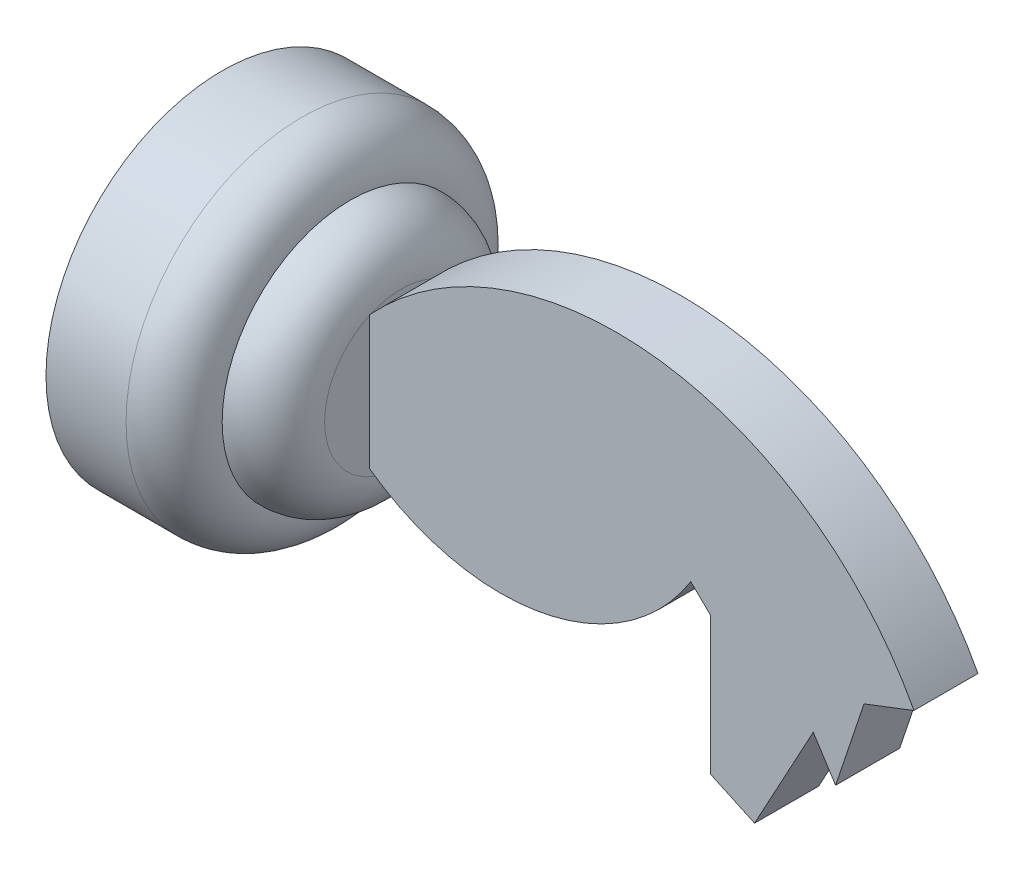
ISO-10303-21;
HEADER;
FILE_DESCRIPTION(('STEP AP214'),'2;1');
FILE_NAME('part.step','',(''),(''),'','','');
FILE_SCHEMA(('AUTOMOTIVE_DESIGN { 1 0 10303 214 1 1 1 1 }'));
ENDSEC;
DATA;
#1=APPLICATION_CONTEXT('core data for automotive mechanical design processes');
#2=APPLICATION_PROTOCOL_DEFINITION('international standard','automotive_design',2000,#1);
#3=PRODUCT_CONTEXT('',#1,'mechanical');
#4=PRODUCT('Part','Part','',(#3));
#5=PRODUCT_RELATED_PRODUCT_CATEGORY('part','',(#4));
#6=PRODUCT_DEFINITION_FORMATION('','',#4);
#7=PRODUCT_DEFINITION_CONTEXT('part definition',#1,'design');
#8=PRODUCT_DEFINITION('design','',#6,#7);
#9=PRODUCT_DEFINITION_SHAPE('','',#8);
#10=(LENGTH_UNIT() NAMED_UNIT(*) SI_UNIT(.MILLI.,.METRE.));
#11=(NAMED_UNIT(*) PLANE_ANGLE_UNIT() SI_UNIT($,.RADIAN.));
#12=(NAMED_UNIT(*) SI_UNIT($,.STERADIAN.) SOLID_ANGLE_UNIT());
#13=UNCERTAINTY_MEASURE_WITH_UNIT(LENGTH_MEASURE(1.E-05),#10,'distance_accuracy_value','');
#14=(GEOMETRIC_REPRESENTATION_CONTEXT(3) GLOBAL_UNCERTAINTY_ASSIGNED_CONTEXT((#13)) GLOBAL_UNIT_ASSIGNED_CONTEXT((#10,
#11,#12)) REPRESENTATION_CONTEXT('',''));
#15=CARTESIAN_POINT('',(0.,0.,0.));
#16=DIRECTION('',(0.,0.,1.));
#17=DIRECTION('',(1.,0.,0.));
#18=AXIS2_PLACEMENT_3D('',#15,#16,#17);
#19=CARTESIAN_POINT('',(11.2,0.,0.));
#20=DIRECTION('',(1.,0.,0.));
#21=DIRECTION('',(0.,0.,-1.));
#22=AXIS2_PLACEMENT_3D('',#19,#20,#21);
#23=PLANE('',#22);
#24=DIRECTION('',(0.,0.,-1.));
#25=VECTOR('',#24,1.);
#26=CARTESIAN_POINT('',(11.2,4.4,2.));
#27=LINE('',#26,#25);
#28=CARTESIAN_POINT('',(11.2,4.4,1.91833260932509));
#29=VERTEX_POINT('',#28);
#30=CARTESIAN_POINT('',(11.2,4.4,-1.91833260932509));
#31=VERTEX_POINT('',#30);
#32=EDGE_CURVE('E155',#29,#31,#27,.T.);
#33=ORIENTED_EDGE('',*,*,#32,.T.);
#34=CARTESIAN_POINT('',(11.2,0.,0.));
#35=DIRECTION('',(-1.,0.,0.));
#36=DIRECTION('',(0.,0.,1.));
#37=AXIS2_PLACEMENT_3D('',#34,#35,#36);
#38=CIRCLE('',#37,4.8);
#39=EDGE_CURVE('E55',#29,#31,#38,.T.);
#40=ORIENTED_EDGE('',*,*,#39,.F.);
#41=EDGE_LOOP('',(#33,#40));
#42=FACE_BOUND('',#41,.T.);
#43=ADVANCED_FACE('F47',(#42),#23,.T.);
#44=DIRECTION('',(0.,1.,0.));
#45=VECTOR('',#44,1.);
#46=CARTESIAN_POINT('',(11.2,0.,2.));
#47=LINE('',#46,#45);
#48=CARTESIAN_POINT('',(11.2,-3.91497825520678,2.));
#49=VERTEX_POINT('',#48);
#50=CARTESIAN_POINT('',(11.2,4.36348484585429,2.));
#51=VERTEX_POINT('',#50);
#52=EDGE_CURVE('E147',#49,#51,#47,.T.);
#53=ORIENTED_EDGE('',*,*,#52,.T.);
#54=CARTESIAN_POINT('',(11.2,4.36348484585429,-2.));
#55=VERTEX_POINT('',#54);
#56=EDGE_CURVE('E56',#55,#51,#38,.T.);
#57=ORIENTED_EDGE('',*,*,#56,.F.);
#58=DIRECTION('',(0.,1.,0.));
#59=VECTOR('',#58,1.);
#60=CARTESIAN_POINT('',(11.2,0.,-2.));
#61=LINE('',#60,#59);
#62=CARTESIAN_POINT('',(11.2,-3.91497825520678,-2.));
#63=VERTEX_POINT('',#62);
#64=EDGE_CURVE('E63',#63,#55,#61,.T.);
#65=ORIENTED_EDGE('',*,*,#64,.F.);
#66=DIRECTION('',(0.,0.,-1.));
#67=VECTOR('',#66,1.);
#68=CARTESIAN_POINT('',(11.2,-3.91497825520678,2.));
#69=LINE('',#68,#67);
#70=EDGE_CURVE('E225',#49,#63,#69,.T.);
#71=ORIENTED_EDGE('',*,*,#70,.F.);
#72=EDGE_LOOP('',(#53,#57,#65,#71));
#73=FACE_BOUND('',#72,.T.);
#74=ADVANCED_FACE('F49',(#73),#23,.T.);
#75=CARTESIAN_POINT('',(8.,0.,0.));
#76=DIRECTION('',(-1.,0.,0.));
#77=DIRECTION('',(0.,0.,1.));
#78=AXIS2_PLACEMENT_3D('',#75,#76,#77);
#79=TOROIDAL_SURFACE('',#78,4.8,3.2);
#80=CARTESIAN_POINT('',(8.,0.,0.));
#81=DIRECTION('',(-1.,0.,0.));
#82=DIRECTION('',(0.,0.,1.));
#83=AXIS2_PLACEMENT_3D('',#80,#81,#82);
#84=CIRCLE('',#83,8.);
#85=CARTESIAN_POINT('',(8.,0.,8.));
#86=VERTEX_POINT('',#85);
#87=EDGE_CURVE('E231',#86,#86,#84,.T.);
#88=ORIENTED_EDGE('',*,*,#87,.F.);
#89=EDGE_LOOP('',(#88));
#90=FACE_BOUND('',#89,.T.);
#91=EDGE_CURVE('E11',#51,#29,#38,.T.);
#92=ORIENTED_EDGE('',*,*,#91,.T.);
#93=ORIENTED_EDGE('',*,*,#39,.T.);
#94=EDGE_CURVE('E70',#31,#55,#38,.T.);
#95=ORIENTED_EDGE('',*,*,#94,.T.);
#96=ORIENTED_EDGE('',*,*,#56,.T.);
#97=EDGE_LOOP('',(#92,#93,#95,#96));
#98=FACE_BOUND('',#97,.T.);
#99=ADVANCED_FACE('F239',(#90,#98),#79,.T.);
#100=CARTESIAN_POINT('',(5.,0.,0.));
#101=DIRECTION('',(-1.,0.,0.));
#102=DIRECTION('',(0.,0.,1.));
#103=AXIS2_PLACEMENT_3D('',#100,#101,#102);
#104=TOROIDAL_SURFACE('',#103,8.,3.);
#105=ORIENTED_EDGE('',*,*,#87,.T.);
#106=EDGE_LOOP('',(#105));
#107=FACE_BOUND('',#106,.T.);
#108=CARTESIAN_POINT('',(5.,0.,0.));
#109=DIRECTION('',(-1.,0.,0.));
#110=DIRECTION('',(0.,0.,1.));
#111=AXIS2_PLACEMENT_3D('',#108,#109,#110);
#112=CIRCLE('',#111,11.);
#113=CARTESIAN_POINT('',(5.,0.,11.));
#114=VERTEX_POINT('',#113);
#115=EDGE_CURVE('E229',#114,#114,#112,.T.);
#116=ORIENTED_EDGE('',*,*,#115,.F.);
#117=EDGE_LOOP('',(#116));
#118=FACE_BOUND('',#117,.T.);
#119=ADVANCED_FACE('F287',(#107,#118),#104,.T.);
#120=CARTESIAN_POINT('',(0.,0.,0.));
#121=DIRECTION('',(-1.,0.,0.));
#122=DIRECTION('',(0.,0.,1.));
#123=AXIS2_PLACEMENT_3D('',#120,#121,#122);
#124=CYLINDRICAL_SURFACE('',#123,11.);
#125=ORIENTED_EDGE('',*,*,#115,.T.);
#126=EDGE_LOOP('',(#125));
#127=FACE_BOUND('',#126,.T.);
#128=CARTESIAN_POINT('',(0.,0.,0.));
#129=DIRECTION('',(-1.,0.,0.));
#130=DIRECTION('',(0.,0.,1.));
#131=AXIS2_PLACEMENT_3D('',#128,#129,#130);
#132=CIRCLE('',#131,11.);
#133=CARTESIAN_POINT('',(0.,0.,11.));
#134=VERTEX_POINT('',#133);
#135=EDGE_CURVE('E156',#134,#134,#132,.T.);
#136=ORIENTED_EDGE('',*,*,#135,.F.);
#137=EDGE_LOOP('',(#136));
#138=FACE_BOUND('',#137,.T.);
#139=ADVANCED_FACE('F300',(#127,#138),#124,.T.);
#140=CARTESIAN_POINT('',(0.,0.,0.));
#141=DIRECTION('',(-1.,0.,0.));
#142=DIRECTION('',(0.,0.,1.));
#143=AXIS2_PLACEMENT_3D('',#140,#141,#142);
#144=PLANE('',#143);
#145=ORIENTED_EDGE('',*,*,#135,.T.);
#146=EDGE_LOOP('',(#145));
#147=FACE_BOUND('',#146,.T.);
#148=ADVANCED_FACE('F296',(#147),#144,.T.);
#149=CARTESIAN_POINT('',(11.2,0.,2.));
#150=DIRECTION('',(-1.,0.,0.));
#151=DIRECTION('',(0.,0.,1.));
#152=AXIS2_PLACEMENT_3D('',#149,#150,#151);
#153=PLANE('',#152);
#154=ORIENTED_EDGE('',*,*,#91,.F.);
#155=CARTESIAN_POINT('',(11.2,4.4,2.));
#156=VERTEX_POINT('',#155);
#157=EDGE_CURVE('E139',#51,#156,#47,.T.);
#158=ORIENTED_EDGE('',*,*,#157,.T.);
#159=EDGE_CURVE('E142',#156,#29,#27,.T.);
#160=ORIENTED_EDGE('',*,*,#159,.T.);
#161=EDGE_LOOP('',(#154,#158,#160));
#162=FACE_BOUND('',#161,.T.);
#163=ADVANCED_FACE('F141',(#162),#153,.T.);
#164=CARTESIAN_POINT('',(26.6430950023222,-9.83062952751044,2.));
#165=DIRECTION('',(0.,0.,-1.));
#166=DIRECTION('',(-1.,0.,0.));
#167=AXIS2_PLACEMENT_3D('',#164,#165,#166);
#168=CYLINDRICAL_SURFACE('',#167,21.);
#169=CARTESIAN_POINT('',(26.6430950023222,-9.83062952751044,-2.));
#170=DIRECTION('',(0.,0.,1.));
#171=DIRECTION('',(1.,0.,0.));
#172=AXIS2_PLACEMENT_3D('',#169,#170,#171);
#173=CIRCLE('',#172,21.);
#174=CARTESIAN_POINT('',(11.2,4.4,-2.));
#175=VERTEX_POINT('',#174);
#176=CARTESIAN_POINT('',(45.2,0.,-2.));
#177=VERTEX_POINT('',#176);
#178=EDGE_CURVE('E186',#175,#177,#173,.F.);
#179=ORIENTED_EDGE('',*,*,#178,.F.);
#180=EDGE_CURVE('E158',#31,#175,#27,.T.);
#181=ORIENTED_EDGE('',*,*,#180,.F.);
#182=ORIENTED_EDGE('',*,*,#32,.F.);
#183=ORIENTED_EDGE('',*,*,#159,.F.);
#184=CARTESIAN_POINT('',(26.6430950023222,-9.83062952751044,2.));
#185=DIRECTION('',(0.,0.,1.));
#186=DIRECTION('',(1.,0.,0.));
#187=AXIS2_PLACEMENT_3D('',#184,#185,#186);
#188=CIRCLE('',#187,21.);
#189=CARTESIAN_POINT('',(45.2,0.,2.));
#190=VERTEX_POINT('',#189);
#191=EDGE_CURVE('E148',#156,#190,#188,.F.);
#192=ORIENTED_EDGE('',*,*,#191,.T.);
#193=DIRECTION('',(0.,0.,-1.));
#194=VECTOR('',#193,1.);
#195=CARTESIAN_POINT('',(45.2,0.,2.));
#196=LINE('',#195,#194);
#197=EDGE_CURVE('E185',#190,#177,#196,.T.);
#198=ORIENTED_EDGE('',*,*,#197,.T.);
#199=EDGE_LOOP('',(#179,#181,#182,#183,#192,#198));
#200=FACE_BOUND('',#199,.T.);
#201=ADVANCED_FACE('F153',(#200),#168,.T.);
#202=ORIENTED_EDGE('',*,*,#94,.F.);
#203=ORIENTED_EDGE('',*,*,#180,.T.);
#204=EDGE_CURVE('E189',#55,#175,#61,.T.);
#205=ORIENTED_EDGE('',*,*,#204,.F.);
#206=EDGE_LOOP('',(#202,#203,#205));
#207=FACE_BOUND('',#206,.T.);
#208=ADVANCED_FACE('F241',(#207),#153,.T.);
#209=CARTESIAN_POINT('',(19.3994308478551,7.43267937847441,2.));
#210=DIRECTION('',(0.,0.,-1.));
#211=DIRECTION('',(-1.,0.,0.));
#212=AXIS2_PLACEMENT_3D('',#209,#210,#211);
#213=CYLINDRICAL_SURFACE('',#212,14.);
#214=CARTESIAN_POINT('',(19.3994308478551,7.43267937847441,-2.));
#215=DIRECTION('',(0.,0.,1.));
#216=DIRECTION('',(1.,0.,0.));
#217=AXIS2_PLACEMENT_3D('',#214,#215,#216);
#218=CIRCLE('',#217,14.);
#219=CARTESIAN_POINT('',(31.263463773332,0.,-2.));
#220=VERTEX_POINT('',#219);
#221=EDGE_CURVE('E191',#220,#63,#218,.F.);
#222=ORIENTED_EDGE('',*,*,#221,.F.);
#223=DIRECTION('',(0.,0.,-1.));
#224=VECTOR('',#223,1.);
#225=CARTESIAN_POINT('',(31.263463773332,0.,2.));
#226=LINE('',#225,#224);
#227=CARTESIAN_POINT('',(31.263463773332,0.,2.));
#228=VERTEX_POINT('',#227);
#229=EDGE_CURVE('E223',#228,#220,#226,.T.);
#230=ORIENTED_EDGE('',*,*,#229,.F.);
#231=CARTESIAN_POINT('',(19.3994308478551,7.43267937847441,2.));
#232=DIRECTION('',(0.,0.,1.));
#233=DIRECTION('',(1.,0.,0.));
#234=AXIS2_PLACEMENT_3D('',#231,#232,#233);
#235=CIRCLE('',#234,14.);
#236=EDGE_CURVE('E169',#228,#49,#235,.F.);
#237=ORIENTED_EDGE('',*,*,#236,.T.);
#238=ORIENTED_EDGE('',*,*,#70,.T.);
#239=EDGE_LOOP('',(#222,#230,#237,#238));
#240=FACE_BOUND('',#239,.T.);
#241=ADVANCED_FACE('F279',(#240),#213,.T.);
#242=CARTESIAN_POINT('',(15.1403569656046,15.6240069272758,2.));
#243=DIRECTION('',(0.695904285191115,0.71813454578696,0.));
#244=DIRECTION('',(-0.71813454578696,0.695904285191115,0.));
#245=AXIS2_PLACEMENT_3D('',#242,#243,#244);
#246=PLANE('',#245);
#247=DIRECTION('',(0.71813454578696,-0.695904285191115,0.));
#248=VECTOR('',#247,1.);
#249=CARTESIAN_POINT('',(15.1403569656046,15.6240069272758,-2.));
#250=LINE('',#249,#248);
#251=CARTESIAN_POINT('',(32.498964702066,-1.19725529945281,-2.));
#252=VERTEX_POINT('',#251);
#253=EDGE_CURVE('E193',#220,#252,#250,.T.);
#254=ORIENTED_EDGE('',*,*,#253,.T.);
#255=DIRECTION('',(0.,0.,-1.));
#256=VECTOR('',#255,1.);
#257=CARTESIAN_POINT('',(32.498964702066,-1.19725529945281,2.));
#258=LINE('',#257,#256);
#259=CARTESIAN_POINT('',(32.498964702066,-1.19725529945281,2.));
#260=VERTEX_POINT('',#259);
#261=EDGE_CURVE('E220',#260,#252,#258,.T.);
#262=ORIENTED_EDGE('',*,*,#261,.F.);
#263=DIRECTION('',(0.71813454578696,-0.695904285191115,0.));
#264=VECTOR('',#263,1.);
#265=CARTESIAN_POINT('',(15.1403569656046,15.6240069272758,2.));
#266=LINE('',#265,#264);
#267=EDGE_CURVE('E172',#228,#260,#266,.T.);
#268=ORIENTED_EDGE('',*,*,#267,.F.);
#269=ORIENTED_EDGE('',*,*,#229,.T.);
#270=EDGE_LOOP('',(#254,#262,#268,#269));
#271=FACE_BOUND('',#270,.T.);
#272=ADVANCED_FACE('F275',(#271),#246,.F.);
#273=CARTESIAN_POINT('',(32.498964702066,0.,2.));
#274=DIRECTION('',(1.,0.,0.));
#275=DIRECTION('',(0.,0.,-1.));
#276=AXIS2_PLACEMENT_3D('',#273,#274,#275);
#277=PLANE('',#276);
#278=DIRECTION('',(0.,-1.,0.));
#279=VECTOR('',#278,1.);
#280=CARTESIAN_POINT('',(32.498964702066,0.,-2.));
#281=LINE('',#280,#279);
#282=CARTESIAN_POINT('',(32.498964702066,-9.79725529945281,-2.));
#283=VERTEX_POINT('',#282);
#284=EDGE_CURVE('E195',#252,#283,#281,.T.);
#285=ORIENTED_EDGE('',*,*,#284,.T.);
#286=DIRECTION('',(0.,0.,-1.));
#287=VECTOR('',#286,1.);
#288=CARTESIAN_POINT('',(32.498964702066,-9.79725529945281,2.));
#289=LINE('',#288,#287);
#290=CARTESIAN_POINT('',(32.498964702066,-9.79725529945281,2.));
#291=VERTEX_POINT('',#290);
#292=EDGE_CURVE('E217',#291,#283,#289,.T.);
#293=ORIENTED_EDGE('',*,*,#292,.F.);
#294=DIRECTION('',(0.,-1.,0.));
#295=VECTOR('',#294,1.);
#296=CARTESIAN_POINT('',(32.498964702066,0.,2.));
#297=LINE('',#296,#295);
#298=EDGE_CURVE('E174',#260,#291,#297,.T.);
#299=ORIENTED_EDGE('',*,*,#298,.F.);
#300=ORIENTED_EDGE('',*,*,#261,.T.);
#301=EDGE_LOOP('',(#285,#293,#299,#300));
#302=FACE_BOUND('',#301,.T.);
#303=ADVANCED_FACE('F271',(#302),#277,.F.);
#304=CARTESIAN_POINT('',(1.99946445082386,4.3197897508319,2.));
#305=DIRECTION('',(0.420047755956167,0.907502001494316,0.));
#306=DIRECTION('',(-0.907502001494316,0.420047755956167,0.));
#307=AXIS2_PLACEMENT_3D('',#304,#305,#306);
#308=PLANE('',#307);
#309=DIRECTION('',(0.907502001494316,-0.420047755956167,0.));
#310=VECTOR('',#309,1.);
#311=CARTESIAN_POINT('',(1.99946445082386,4.3197897508319,-2.));
#312=LINE('',#311,#310);
#313=CARTESIAN_POINT('',(35.2486957665938,-11.07,-2.));
#314=VERTEX_POINT('',#313);
#315=EDGE_CURVE('E197',#283,#314,#312,.T.);
#316=ORIENTED_EDGE('',*,*,#315,.T.);
#317=DIRECTION('',(0.,0.,-1.));
#318=VECTOR('',#317,1.);
#319=CARTESIAN_POINT('',(35.2486957665938,-11.07,2.));
#320=LINE('',#319,#318);
#321=CARTESIAN_POINT('',(35.2486957665938,-11.07,2.));
#322=VERTEX_POINT('',#321);
#323=EDGE_CURVE('E214',#322,#314,#320,.T.);
#324=ORIENTED_EDGE('',*,*,#323,.F.);
#325=DIRECTION('',(0.907502001494316,-0.420047755956167,0.));
#326=VECTOR('',#325,1.);
#327=CARTESIAN_POINT('',(1.99946445082386,4.3197897508319,2.));
#328=LINE('',#327,#326);
#329=EDGE_CURVE('E176',#291,#322,#328,.T.);
#330=ORIENTED_EDGE('',*,*,#329,.F.);
#331=ORIENTED_EDGE('',*,*,#292,.T.);
#332=EDGE_LOOP('',(#316,#324,#330,#331));
#333=FACE_BOUND('',#332,.T.);
#334=ADVANCED_FACE('F266',(#333),#308,.F.);
#335=CARTESIAN_POINT('',(31.8696932080387,-17.2961223907554,2.));
#336=DIRECTION('',(-0.87890625,0.47699455312502,0.));
#337=DIRECTION('',(-0.47699455312502,-0.87890625,0.));
#338=AXIS2_PLACEMENT_3D('',#335,#336,#337);
#339=PLANE('',#338);
#340=DIRECTION('',(0.47699455312502,0.87890625,0.));
#341=VECTOR('',#340,1.);
#342=CARTESIAN_POINT('',(31.8696932080387,-17.2961223907554,-2.));
#343=LINE('',#342,#341);
#344=CARTESIAN_POINT('',(38.9120139345939,-4.32,-2.));
#345=VERTEX_POINT('',#344);
#346=EDGE_CURVE('E199',#314,#345,#343,.T.);
#347=ORIENTED_EDGE('',*,*,#346,.T.);
#348=DIRECTION('',(0.,0.,-1.));
#349=VECTOR('',#348,1.);
#350=CARTESIAN_POINT('',(38.9120139345939,-4.32,2.));
#351=LINE('',#350,#349);
#352=CARTESIAN_POINT('',(38.9120139345939,-4.32,2.));
#353=VERTEX_POINT('',#352);
#354=EDGE_CURVE('E211',#353,#345,#351,.T.);
#355=ORIENTED_EDGE('',*,*,#354,.F.);
#356=DIRECTION('',(0.47699455312502,0.87890625,0.));
#357=VECTOR('',#356,1.);
#358=CARTESIAN_POINT('',(31.8696932080387,-17.2961223907554,2.));
#359=LINE('',#358,#357);
#360=EDGE_CURVE('E178',#322,#353,#359,.T.);
#361=ORIENTED_EDGE('',*,*,#360,.F.);
#362=ORIENTED_EDGE('',*,*,#323,.T.);
#363=EDGE_LOOP('',(#347,#355,#361,#362));
#364=FACE_BOUND('',#363,.T.);
#365=ADVANCED_FACE('F260',(#364),#339,.F.);
#366=CARTESIAN_POINT('',(25.561946300607,16.4389062035767,2.));
#367=DIRECTION('',(0.84108527131783,0.540902547943909,0.));
#368=DIRECTION('',(-0.540902547943909,0.84108527131783,0.));
#369=AXIS2_PLACEMENT_3D('',#366,#367,#368);
#370=PLANE('',#369);
#371=DIRECTION('',(0.540902547943909,-0.84108527131783,0.));
#372=VECTOR('',#371,1.);
#373=CARTESIAN_POINT('',(25.561946300607,16.4389062035767,-2.));
#374=LINE('',#373,#372);
#375=CARTESIAN_POINT('',(40.3075425082892,-6.49,-2.));
#376=VERTEX_POINT('',#375);
#377=EDGE_CURVE('E201',#345,#376,#374,.T.);
#378=ORIENTED_EDGE('',*,*,#377,.T.);
#379=DIRECTION('',(0.,0.,-1.));
#380=VECTOR('',#379,1.);
#381=CARTESIAN_POINT('',(40.3075425082892,-6.49,2.));
#382=LINE('',#381,#380);
#383=CARTESIAN_POINT('',(40.3075425082892,-6.49,2.));
#384=VERTEX_POINT('',#383);
#385=EDGE_CURVE('E208',#384,#376,#382,.T.);
#386=ORIENTED_EDGE('',*,*,#385,.F.);
#387=DIRECTION('',(0.540902547943909,-0.84108527131783,0.));
#388=VECTOR('',#387,1.);
#389=CARTESIAN_POINT('',(25.561946300607,16.4389062035767,2.));
#390=LINE('',#389,#388);
#391=EDGE_CURVE('E180',#353,#384,#390,.T.);
#392=ORIENTED_EDGE('',*,*,#391,.F.);
#393=ORIENTED_EDGE('',*,*,#354,.T.);
#394=EDGE_LOOP('',(#378,#386,#392,#393));
#395=FACE_BOUND('',#394,.T.);
#396=ADVANCED_FACE('F256',(#395),#370,.F.);
#397=CARTESIAN_POINT('',(38.1844392608772,-12.8157644415364,2.));
#398=DIRECTION('',(-0.948028673835126,0.318184904711731,0.));
#399=DIRECTION('',(-0.318184904711731,-0.948028673835126,0.));
#400=AXIS2_PLACEMENT_3D('',#397,#398,#399);
#401=PLANE('',#400);
#402=DIRECTION('',(0.318184904711731,0.948028673835126,0.));
#403=VECTOR('',#402,1.);
#404=CARTESIAN_POINT('',(38.1844392608772,-12.8157644415364,-2.));
#405=LINE('',#404,#403);
#406=CARTESIAN_POINT('',(42.0830142765807,-1.2,-2.));
#407=VERTEX_POINT('',#406);
#408=EDGE_CURVE('E166',#376,#407,#405,.T.);
#409=ORIENTED_EDGE('',*,*,#408,.T.);
#410=DIRECTION('',(0.,0.,-1.));
#411=VECTOR('',#410,1.);
#412=CARTESIAN_POINT('',(42.0830142765807,-1.2,2.));
#413=LINE('',#412,#411);
#414=CARTESIAN_POINT('',(42.0830142765807,-1.2,2.));
#415=VERTEX_POINT('',#414);
#416=EDGE_CURVE('E205',#415,#407,#413,.T.);
#417=ORIENTED_EDGE('',*,*,#416,.F.);
#418=DIRECTION('',(0.318184904711731,0.948028673835126,0.));
#419=VECTOR('',#418,1.);
#420=CARTESIAN_POINT('',(38.1844392608772,-12.8157644415364,2.));
#421=LINE('',#420,#419);
#422=EDGE_CURVE('E182',#384,#415,#421,.T.);
#423=ORIENTED_EDGE('',*,*,#422,.F.);
#424=ORIENTED_EDGE('',*,*,#385,.T.);
#425=EDGE_LOOP('',(#409,#417,#423,#424));
#426=FACE_BOUND('',#425,.T.);
#427=ADVANCED_FACE('F251',(#426),#401,.F.);
#428=CARTESIAN_POINT('',(5.83455842805408,-15.1551961022505,2.));
#429=DIRECTION('',(-0.359281437125749,0.933229258508785,0.));
#430=DIRECTION('',(-0.933229258508785,-0.359281437125749,0.));
#431=AXIS2_PLACEMENT_3D('',#428,#429,#430);
#432=PLANE('',#431);
#433=DIRECTION('',(0.933229258508785,0.359281437125749,0.));
#434=VECTOR('',#433,1.);
#435=CARTESIAN_POINT('',(5.83455842805408,-15.1551961022505,-2.));
#436=LINE('',#435,#434);
#437=EDGE_CURVE('E163',#407,#177,#436,.T.);
#438=ORIENTED_EDGE('',*,*,#437,.T.);
#439=ORIENTED_EDGE('',*,*,#197,.F.);
#440=DIRECTION('',(0.933229258508785,0.359281437125749,0.));
#441=VECTOR('',#440,1.);
#442=CARTESIAN_POINT('',(5.83455842805408,-15.1551961022505,2.));
#443=LINE('',#442,#441);
#444=EDGE_CURVE('E161',#415,#190,#443,.T.);
#445=ORIENTED_EDGE('',*,*,#444,.F.);
#446=ORIENTED_EDGE('',*,*,#416,.T.);
#447=EDGE_LOOP('',(#438,#439,#445,#446));
#448=FACE_BOUND('',#447,.T.);
#449=ADVANCED_FACE('F245',(#448),#432,.F.);
#450=CARTESIAN_POINT('',(0.,0.,2.));
#451=DIRECTION('',(0.,0.,1.));
#452=DIRECTION('',(1.,0.,0.));
#453=AXIS2_PLACEMENT_3D('',#450,#451,#452);
#454=PLANE('',#453);
#455=ORIENTED_EDGE('',*,*,#191,.F.);
#456=ORIENTED_EDGE('',*,*,#157,.F.);
#457=ORIENTED_EDGE('',*,*,#52,.F.);
#458=ORIENTED_EDGE('',*,*,#236,.F.);
#459=ORIENTED_EDGE('',*,*,#267,.T.);
#460=ORIENTED_EDGE('',*,*,#298,.T.);
#461=ORIENTED_EDGE('',*,*,#329,.T.);
#462=ORIENTED_EDGE('',*,*,#360,.T.);
#463=ORIENTED_EDGE('',*,*,#391,.T.);
#464=ORIENTED_EDGE('',*,*,#422,.T.);
#465=ORIENTED_EDGE('',*,*,#444,.T.);
#466=EDGE_LOOP('',(#455,#456,#457,#458,#459,#460,#461,#462,#463,#464,#465));
#467=FACE_BOUND('',#466,.T.);
#468=ADVANCED_FACE('F159',(#467),#454,.T.);
#469=CARTESIAN_POINT('',(0.,0.,-2.));
#470=DIRECTION('',(0.,0.,1.));
#471=DIRECTION('',(1.,0.,0.));
#472=AXIS2_PLACEMENT_3D('',#469,#470,#471);
#473=PLANE('',#472);
#474=ORIENTED_EDGE('',*,*,#178,.T.);
#475=ORIENTED_EDGE('',*,*,#437,.F.);
#476=ORIENTED_EDGE('',*,*,#408,.F.);
#477=ORIENTED_EDGE('',*,*,#377,.F.);
#478=ORIENTED_EDGE('',*,*,#346,.F.);
#479=ORIENTED_EDGE('',*,*,#315,.F.);
#480=ORIENTED_EDGE('',*,*,#284,.F.);
#481=ORIENTED_EDGE('',*,*,#253,.F.);
#482=ORIENTED_EDGE('',*,*,#221,.T.);
#483=ORIENTED_EDGE('',*,*,#64,.T.);
#484=ORIENTED_EDGE('',*,*,#204,.T.);
#485=EDGE_LOOP('',(#474,#475,#476,#477,#478,#479,#480,#481,#482,#483,#484));
#486=FACE_BOUND('',#485,.T.);
#487=ADVANCED_FACE('F242',(#486),#473,.F.);
#488=CLOSED_SHELL('',(#43,#74,#99,#119,#139,#148,#163,#201,#208,#241,#272,#303,#334,#365,#396,
#427,#449,#468,#487));
#489=MANIFOLD_SOLID_BREP('B2',#488);
#490=ADVANCED_BREP_SHAPE_REPRESENTATION('',(#18,#489),#14);
#491=SHAPE_DEFINITION_REPRESENTATION(#9,#490);
ENDSEC;
END-ISO-10303-21;
